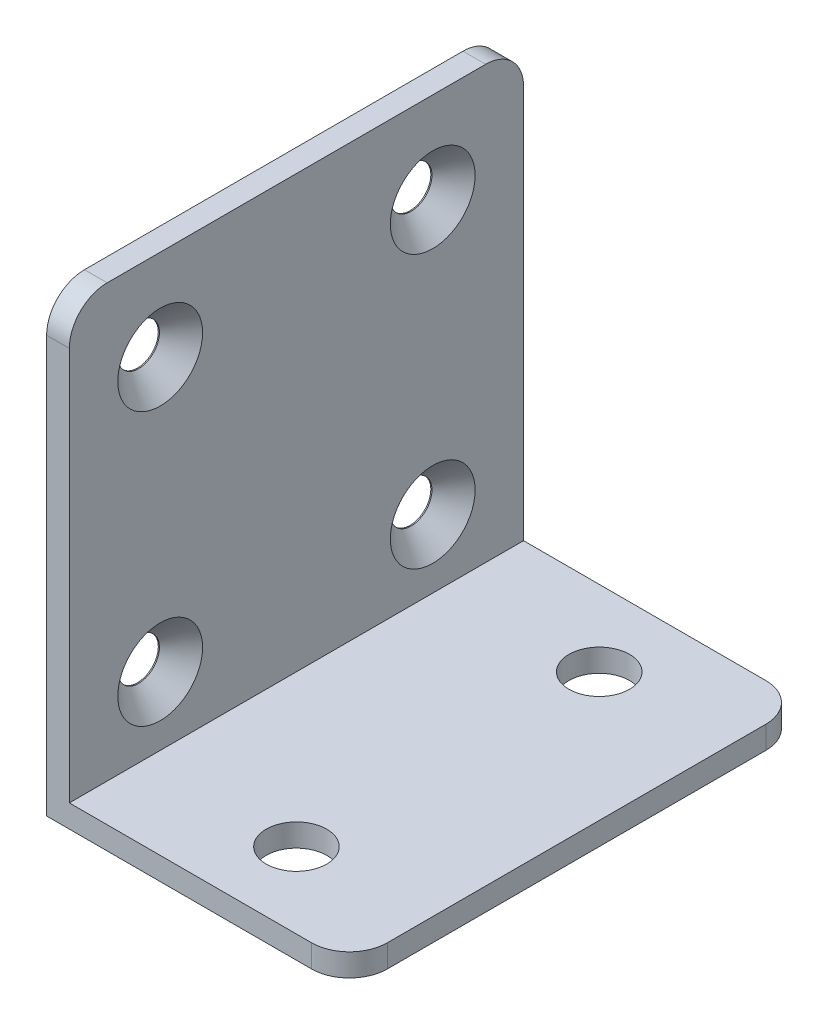
ISO-10303-21;
HEADER;
FILE_DESCRIPTION(('STEP AP214'),'2;1');
FILE_NAME('part.step','',(''),(''),'','','');
FILE_SCHEMA(('AUTOMOTIVE_DESIGN { 1 0 10303 214 1 1 1 1 }'));
ENDSEC;
DATA;
#1=APPLICATION_CONTEXT('core data for automotive mechanical design processes');
#2=APPLICATION_PROTOCOL_DEFINITION('international standard','automotive_design',2000,#1);
#3=PRODUCT_CONTEXT('',#1,'mechanical');
#4=PRODUCT('Part','Part','',(#3));
#5=PRODUCT_RELATED_PRODUCT_CATEGORY('part','',(#4));
#6=PRODUCT_DEFINITION_FORMATION('','',#4);
#7=PRODUCT_DEFINITION_CONTEXT('part definition',#1,'design');
#8=PRODUCT_DEFINITION('design','',#6,#7);
#9=PRODUCT_DEFINITION_SHAPE('','',#8);
#10=(LENGTH_UNIT() NAMED_UNIT(*) SI_UNIT(.MILLI.,.METRE.));
#11=(NAMED_UNIT(*) PLANE_ANGLE_UNIT() SI_UNIT($,.RADIAN.));
#12=(NAMED_UNIT(*) SI_UNIT($,.STERADIAN.) SOLID_ANGLE_UNIT());
#13=UNCERTAINTY_MEASURE_WITH_UNIT(LENGTH_MEASURE(1.E-05),#10,'distance_accuracy_value','');
#14=(GEOMETRIC_REPRESENTATION_CONTEXT(3) GLOBAL_UNCERTAINTY_ASSIGNED_CONTEXT((#13)) GLOBAL_UNIT_ASSIGNED_CONTEXT((#10,
#11,#12)) REPRESENTATION_CONTEXT('',''));
#15=CARTESIAN_POINT('',(0.,0.,0.));
#16=DIRECTION('',(0.,0.,1.));
#17=DIRECTION('',(1.,0.,0.));
#18=AXIS2_PLACEMENT_3D('',#15,#16,#17);
#19=CARTESIAN_POINT('',(20.,-30.,-30.));
#20=DIRECTION('',(1.,0.,0.));
#21=DIRECTION('',(0.,0.,-1.));
#22=AXIS2_PLACEMENT_3D('',#19,#20,#21);
#23=PLANE('',#22);
#24=DIRECTION('',(0.,0.,1.));
#25=VECTOR('',#24,1.);
#26=CARTESIAN_POINT('',(20.,-30.,-30.));
#27=LINE('',#26,#25);
#28=CARTESIAN_POINT('',(20.,-30.,-25.));
#29=VERTEX_POINT('',#28);
#30=CARTESIAN_POINT('',(20.,-30.,25.));
#31=VERTEX_POINT('',#30);
#32=EDGE_CURVE('E160',#29,#31,#27,.T.);
#33=ORIENTED_EDGE('',*,*,#32,.F.);
#34=DIRECTION('',(0.,1.,0.));
#35=VECTOR('',#34,1.);
#36=CARTESIAN_POINT('',(20.,-30.,-25.));
#37=LINE('',#36,#35);
#38=CARTESIAN_POINT('',(20.,-27.,-25.));
#39=VERTEX_POINT('',#38);
#40=EDGE_CURVE('E216',#29,#39,#37,.T.);
#41=ORIENTED_EDGE('',*,*,#40,.T.);
#42=DIRECTION('',(0.,0.,1.));
#43=VECTOR('',#42,1.);
#44=CARTESIAN_POINT('',(20.,-27.,-30.));
#45=LINE('',#44,#43);
#46=CARTESIAN_POINT('',(20.,-27.,25.));
#47=VERTEX_POINT('',#46);
#48=EDGE_CURVE('E135',#39,#47,#45,.T.);
#49=ORIENTED_EDGE('',*,*,#48,.T.);
#50=DIRECTION('',(0.,1.,0.));
#51=VECTOR('',#50,1.);
#52=CARTESIAN_POINT('',(20.,-30.,25.));
#53=LINE('',#52,#51);
#54=EDGE_CURVE('E52',#47,#31,#53,.F.);
#55=ORIENTED_EDGE('',*,*,#54,.T.);
#56=EDGE_LOOP('',(#33,#41,#49,#55));
#57=FACE_BOUND('',#56,.T.);
#58=ADVANCED_FACE('F37',(#57),#23,.T.);
#59=CARTESIAN_POINT('',(-20.,-30.,-30.));
#60=DIRECTION('',(0.,-1.,0.));
#61=DIRECTION('',(0.,0.,-1.));
#62=AXIS2_PLACEMENT_3D('',#59,#60,#61);
#63=PLANE('',#62);
#64=CARTESIAN_POINT('',(3.00000000000002,-30.,20.));
#65=DIRECTION('',(0.,-1.,0.));
#66=DIRECTION('',(0.,0.,-1.));
#67=AXIS2_PLACEMENT_3D('',#64,#65,#66);
#68=CIRCLE('',#67,4.);
#69=CARTESIAN_POINT('',(3.00000000000002,-30.,16.));
#70=VERTEX_POINT('',#69);
#71=EDGE_CURVE('E171',#70,#70,#68,.T.);
#72=ORIENTED_EDGE('',*,*,#71,.F.);
#73=EDGE_LOOP('',(#72));
#74=FACE_BOUND('',#73,.T.);
#75=CARTESIAN_POINT('',(3.00000000000002,-30.,-20.));
#76=DIRECTION('',(0.,-1.,0.));
#77=DIRECTION('',(0.,0.,1.));
#78=AXIS2_PLACEMENT_3D('',#75,#76,#77);
#79=CIRCLE('',#78,4.);
#80=CARTESIAN_POINT('',(3.00000000000002,-30.,-16.));
#81=VERTEX_POINT('',#80);
#82=EDGE_CURVE('E177',#81,#81,#79,.T.);
#83=ORIENTED_EDGE('',*,*,#82,.F.);
#84=EDGE_LOOP('',(#83));
#85=FACE_BOUND('',#84,.T.);
#86=DIRECTION('',(1.,0.,0.));
#87=VECTOR('',#86,1.);
#88=CARTESIAN_POINT('',(-20.,-30.,-30.));
#89=LINE('',#88,#87);
#90=CARTESIAN_POINT('',(-20.,-30.,-30.));
#91=VERTEX_POINT('',#90);
#92=CARTESIAN_POINT('',(15.,-30.,-30.));
#93=VERTEX_POINT('',#92);
#94=EDGE_CURVE('E157',#91,#93,#89,.T.);
#95=ORIENTED_EDGE('',*,*,#94,.T.);
#96=CARTESIAN_POINT('',(15.,-30.,-25.));
#97=DIRECTION('',(0.,-1.,0.));
#98=DIRECTION('',(0.,0.,-1.));
#99=AXIS2_PLACEMENT_3D('',#96,#97,#98);
#100=CIRCLE('',#99,5.);
#101=EDGE_CURVE('E11',#93,#29,#100,.T.);
#102=ORIENTED_EDGE('',*,*,#101,.T.);
#103=ORIENTED_EDGE('',*,*,#32,.T.);
#104=CARTESIAN_POINT('',(15.,-30.,25.));
#105=DIRECTION('',(0.,-1.,0.));
#106=DIRECTION('',(0.,0.,-1.));
#107=AXIS2_PLACEMENT_3D('',#104,#105,#106);
#108=CIRCLE('',#107,5.);
#109=CARTESIAN_POINT('',(15.,-30.,30.));
#110=VERTEX_POINT('',#109);
#111=EDGE_CURVE('E45',#31,#110,#108,.T.);
#112=ORIENTED_EDGE('',*,*,#111,.T.);
#113=DIRECTION('',(1.,0.,0.));
#114=VECTOR('',#113,1.);
#115=CARTESIAN_POINT('',(-20.,-30.,30.));
#116=LINE('',#115,#114);
#117=CARTESIAN_POINT('',(-20.,-30.,30.));
#118=VERTEX_POINT('',#117);
#119=EDGE_CURVE('E152',#118,#110,#116,.T.);
#120=ORIENTED_EDGE('',*,*,#119,.F.);
#121=DIRECTION('',(0.,0.,1.));
#122=VECTOR('',#121,1.);
#123=CARTESIAN_POINT('',(-20.,-30.,-30.));
#124=LINE('',#123,#122);
#125=EDGE_CURVE('E163',#91,#118,#124,.T.);
#126=ORIENTED_EDGE('',*,*,#125,.F.);
#127=EDGE_LOOP('',(#95,#102,#103,#112,#120,#126));
#128=FACE_BOUND('',#127,.T.);
#129=ADVANCED_FACE('F223',(#74,#85,#128),#63,.T.);
#130=CARTESIAN_POINT('',(-20.,-30.,-30.));
#131=DIRECTION('',(-1.,0.,0.));
#132=DIRECTION('',(0.,0.,1.));
#133=AXIS2_PLACEMENT_3D('',#130,#131,#132);
#134=PLANE('',#133);
#135=CARTESIAN_POINT('',(-20.,18.,18.));
#136=DIRECTION('',(-1.,0.,0.));
#137=DIRECTION('',(0.,0.,1.));
#138=AXIS2_PLACEMENT_3D('',#135,#136,#137);
#139=CIRCLE('',#138,2.75);
#140=CARTESIAN_POINT('',(-20.,18.,20.75));
#141=VERTEX_POINT('',#140);
#142=EDGE_CURVE('E189',#141,#141,#139,.T.);
#143=ORIENTED_EDGE('',*,*,#142,.F.);
#144=EDGE_LOOP('',(#143));
#145=FACE_BOUND('',#144,.T.);
#146=CARTESIAN_POINT('',(-20.,18.,-18.));
#147=DIRECTION('',(-1.,0.,0.));
#148=DIRECTION('',(0.,0.,1.));
#149=AXIS2_PLACEMENT_3D('',#146,#147,#148);
#150=CIRCLE('',#149,2.75);
#151=CARTESIAN_POINT('',(-20.,18.,-15.25));
#152=VERTEX_POINT('',#151);
#153=EDGE_CURVE('E184',#152,#152,#150,.T.);
#154=ORIENTED_EDGE('',*,*,#153,.F.);
#155=EDGE_LOOP('',(#154));
#156=FACE_BOUND('',#155,.T.);
#157=CARTESIAN_POINT('',(-20.,-18.,-18.));
#158=DIRECTION('',(-1.,0.,0.));
#159=DIRECTION('',(0.,0.,1.));
#160=AXIS2_PLACEMENT_3D('',#157,#158,#159);
#161=CIRCLE('',#160,2.75);
#162=CARTESIAN_POINT('',(-20.,-18.,-15.25));
#163=VERTEX_POINT('',#162);
#164=EDGE_CURVE('E179',#163,#163,#161,.T.);
#165=ORIENTED_EDGE('',*,*,#164,.F.);
#166=EDGE_LOOP('',(#165));
#167=FACE_BOUND('',#166,.T.);
#168=CARTESIAN_POINT('',(-20.,-18.,18.));
#169=DIRECTION('',(-1.,0.,0.));
#170=DIRECTION('',(0.,0.,1.));
#171=AXIS2_PLACEMENT_3D('',#168,#169,#170);
#172=CIRCLE('',#171,2.75);
#173=CARTESIAN_POINT('',(-20.,-18.,20.75));
#174=VERTEX_POINT('',#173);
#175=EDGE_CURVE('E174',#174,#174,#172,.T.);
#176=ORIENTED_EDGE('',*,*,#175,.F.);
#177=EDGE_LOOP('',(#176));
#178=FACE_BOUND('',#177,.T.);
#179=DIRECTION('',(0.,0.,1.));
#180=VECTOR('',#179,1.);
#181=CARTESIAN_POINT('',(-20.,30.,-30.));
#182=LINE('',#181,#180);
#183=CARTESIAN_POINT('',(-20.,30.,-25.));
#184=VERTEX_POINT('',#183);
#185=CARTESIAN_POINT('',(-20.,30.,25.));
#186=VERTEX_POINT('',#185);
#187=EDGE_CURVE('E159',#184,#186,#182,.T.);
#188=ORIENTED_EDGE('',*,*,#187,.F.);
#189=CARTESIAN_POINT('',(-20.,25.,-25.));
#190=DIRECTION('',(-1.,0.,0.));
#191=DIRECTION('',(0.,0.,1.));
#192=AXIS2_PLACEMENT_3D('',#189,#190,#191);
#193=CIRCLE('',#192,5.);
#194=CARTESIAN_POINT('',(-20.,25.,-30.));
#195=VERTEX_POINT('',#194);
#196=EDGE_CURVE('E200',#184,#195,#193,.T.);
#197=ORIENTED_EDGE('',*,*,#196,.T.);
#198=DIRECTION('',(0.,-1.,0.));
#199=VECTOR('',#198,1.);
#200=CARTESIAN_POINT('',(-20.,-30.,-30.));
#201=LINE('',#200,#199);
#202=EDGE_CURVE('E155',#195,#91,#201,.T.);
#203=ORIENTED_EDGE('',*,*,#202,.T.);
#204=ORIENTED_EDGE('',*,*,#125,.T.);
#205=DIRECTION('',(0.,-1.,0.));
#206=VECTOR('',#205,1.);
#207=CARTESIAN_POINT('',(-20.,-30.,30.));
#208=LINE('',#207,#206);
#209=CARTESIAN_POINT('',(-20.,25.,30.));
#210=VERTEX_POINT('',#209);
#211=EDGE_CURVE('E149',#210,#118,#208,.T.);
#212=ORIENTED_EDGE('',*,*,#211,.F.);
#213=CARTESIAN_POINT('',(-20.,25.,25.));
#214=DIRECTION('',(-1.,0.,0.));
#215=DIRECTION('',(0.,0.,1.));
#216=AXIS2_PLACEMENT_3D('',#213,#214,#215);
#217=CIRCLE('',#216,5.);
#218=EDGE_CURVE('E198',#210,#186,#217,.T.);
#219=ORIENTED_EDGE('',*,*,#218,.T.);
#220=EDGE_LOOP('',(#188,#197,#203,#204,#212,#219));
#221=FACE_BOUND('',#220,.T.);
#222=ADVANCED_FACE('F236',(#145,#156,#167,#178,#221),#134,.T.);
#223=CARTESIAN_POINT('',(-20.,30.,-30.));
#224=DIRECTION('',(0.,1.,0.));
#225=DIRECTION('',(0.,0.,1.));
#226=AXIS2_PLACEMENT_3D('',#223,#224,#225);
#227=PLANE('',#226);
#228=DIRECTION('',(0.,0.,1.));
#229=VECTOR('',#228,1.);
#230=CARTESIAN_POINT('',(-17.,30.,-30.));
#231=LINE('',#230,#229);
#232=CARTESIAN_POINT('',(-17.,30.,-25.));
#233=VERTEX_POINT('',#232);
#234=CARTESIAN_POINT('',(-17.,30.,25.));
#235=VERTEX_POINT('',#234);
#236=EDGE_CURVE('E136',#233,#235,#231,.T.);
#237=ORIENTED_EDGE('',*,*,#236,.F.);
#238=DIRECTION('',(-1.,0.,0.));
#239=VECTOR('',#238,1.);
#240=CARTESIAN_POINT('',(-20.,30.,-25.));
#241=LINE('',#240,#239);
#242=EDGE_CURVE('E195',#233,#184,#241,.T.);
#243=ORIENTED_EDGE('',*,*,#242,.T.);
#244=ORIENTED_EDGE('',*,*,#187,.T.);
#245=DIRECTION('',(-1.,0.,0.));
#246=VECTOR('',#245,1.);
#247=CARTESIAN_POINT('',(-17.,30.,25.));
#248=LINE('',#247,#246);
#249=EDGE_CURVE('E162',#186,#235,#248,.F.);
#250=ORIENTED_EDGE('',*,*,#249,.T.);
#251=EDGE_LOOP('',(#237,#243,#244,#250));
#252=FACE_BOUND('',#251,.T.);
#253=ADVANCED_FACE('F243',(#252),#227,.T.);
#254=CARTESIAN_POINT('',(0.,0.,-30.));
#255=DIRECTION('',(0.,0.,-1.));
#256=DIRECTION('',(-1.,0.,0.));
#257=AXIS2_PLACEMENT_3D('',#254,#255,#256);
#258=PLANE('',#257);
#259=ORIENTED_EDGE('',*,*,#202,.F.);
#260=DIRECTION('',(-1.,0.,0.));
#261=VECTOR('',#260,1.);
#262=CARTESIAN_POINT('',(0.,25.,-30.));
#263=LINE('',#262,#261);
#264=CARTESIAN_POINT('',(-17.,25.,-30.));
#265=VERTEX_POINT('',#264);
#266=EDGE_CURVE('E122',#195,#265,#263,.F.);
#267=ORIENTED_EDGE('',*,*,#266,.T.);
#268=DIRECTION('',(0.,-1.,0.));
#269=VECTOR('',#268,1.);
#270=CARTESIAN_POINT('',(-17.,30.,-30.));
#271=LINE('',#270,#269);
#272=CARTESIAN_POINT('',(-17.,-27.,-30.));
#273=VERTEX_POINT('',#272);
#274=EDGE_CURVE('E114',#265,#273,#271,.T.);
#275=ORIENTED_EDGE('',*,*,#274,.T.);
#276=DIRECTION('',(1.,0.,0.));
#277=VECTOR('',#276,1.);
#278=CARTESIAN_POINT('',(20.,-27.,-30.));
#279=LINE('',#278,#277);
#280=CARTESIAN_POINT('',(15.,-27.,-30.));
#281=VERTEX_POINT('',#280);
#282=EDGE_CURVE('E119',#273,#281,#279,.T.);
#283=ORIENTED_EDGE('',*,*,#282,.T.);
#284=DIRECTION('',(0.,1.,0.));
#285=VECTOR('',#284,1.);
#286=CARTESIAN_POINT('',(15.,0.,-30.));
#287=LINE('',#286,#285);
#288=EDGE_CURVE('E202',#281,#93,#287,.F.);
#289=ORIENTED_EDGE('',*,*,#288,.T.);
#290=ORIENTED_EDGE('',*,*,#94,.F.);
#291=EDGE_LOOP('',(#259,#267,#275,#283,#289,#290));
#292=FACE_BOUND('',#291,.T.);
#293=ADVANCED_FACE('F117',(#292),#258,.T.);
#294=CARTESIAN_POINT('',(0.,0.,30.));
#295=DIRECTION('',(0.,0.,-1.));
#296=DIRECTION('',(-1.,0.,0.));
#297=AXIS2_PLACEMENT_3D('',#294,#295,#296);
#298=PLANE('',#297);
#299=DIRECTION('',(0.,-1.,0.));
#300=VECTOR('',#299,1.);
#301=CARTESIAN_POINT('',(-17.,30.,30.));
#302=LINE('',#301,#300);
#303=CARTESIAN_POINT('',(-17.,25.,30.));
#304=VERTEX_POINT('',#303);
#305=CARTESIAN_POINT('',(-17.,-27.,30.));
#306=VERTEX_POINT('',#305);
#307=EDGE_CURVE('E131',#304,#306,#302,.T.);
#308=ORIENTED_EDGE('',*,*,#307,.F.);
#309=DIRECTION('',(-1.,0.,0.));
#310=VECTOR('',#309,1.);
#311=CARTESIAN_POINT('',(-20.,25.,30.));
#312=LINE('',#311,#310);
#313=EDGE_CURVE('E212',#304,#210,#312,.T.);
#314=ORIENTED_EDGE('',*,*,#313,.T.);
#315=ORIENTED_EDGE('',*,*,#211,.T.);
#316=ORIENTED_EDGE('',*,*,#119,.T.);
#317=DIRECTION('',(0.,1.,0.));
#318=VECTOR('',#317,1.);
#319=CARTESIAN_POINT('',(15.,-27.,30.));
#320=LINE('',#319,#318);
#321=CARTESIAN_POINT('',(15.,-27.,30.));
#322=VERTEX_POINT('',#321);
#323=EDGE_CURVE('E209',#110,#322,#320,.T.);
#324=ORIENTED_EDGE('',*,*,#323,.T.);
#325=DIRECTION('',(1.,0.,0.));
#326=VECTOR('',#325,1.);
#327=CARTESIAN_POINT('',(20.,-27.,30.));
#328=LINE('',#327,#326);
#329=EDGE_CURVE('E125',#306,#322,#328,.T.);
#330=ORIENTED_EDGE('',*,*,#329,.F.);
#331=EDGE_LOOP('',(#308,#314,#315,#316,#324,#330));
#332=FACE_BOUND('',#331,.T.);
#333=ADVANCED_FACE('F228',(#332),#298,.F.);
#334=CARTESIAN_POINT('',(20.,-27.,-30.));
#335=DIRECTION('',(0.,-1.,0.));
#336=DIRECTION('',(1.,0.,0.));
#337=AXIS2_PLACEMENT_3D('',#334,#335,#336);
#338=PLANE('',#337);
#339=CARTESIAN_POINT('',(3.00000000000002,-27.,20.));
#340=DIRECTION('',(0.,-1.,0.));
#341=DIRECTION('',(1.,0.,0.));
#342=AXIS2_PLACEMENT_3D('',#339,#340,#341);
#343=CIRCLE('',#342,4.);
#344=CARTESIAN_POINT('',(7.00000000000002,-27.,20.));
#345=VERTEX_POINT('',#344);
#346=EDGE_CURVE('E147',#345,#345,#343,.T.);
#347=ORIENTED_EDGE('',*,*,#346,.T.);
#348=EDGE_LOOP('',(#347));
#349=FACE_BOUND('',#348,.T.);
#350=CARTESIAN_POINT('',(3.00000000000002,-27.,-20.));
#351=DIRECTION('',(0.,-1.,0.));
#352=DIRECTION('',(1.,0.,0.));
#353=AXIS2_PLACEMENT_3D('',#350,#351,#352);
#354=CIRCLE('',#353,4.);
#355=CARTESIAN_POINT('',(7.00000000000002,-27.,-20.));
#356=VERTEX_POINT('',#355);
#357=EDGE_CURVE('E168',#356,#356,#354,.T.);
#358=ORIENTED_EDGE('',*,*,#357,.T.);
#359=EDGE_LOOP('',(#358));
#360=FACE_BOUND('',#359,.T.);
#361=ORIENTED_EDGE('',*,*,#48,.F.);
#362=CARTESIAN_POINT('',(15.,-27.,-25.));
#363=DIRECTION('',(0.,-1.,0.));
#364=DIRECTION('',(1.,0.,0.));
#365=AXIS2_PLACEMENT_3D('',#362,#363,#364);
#366=CIRCLE('',#365,5.);
#367=EDGE_CURVE('E140',#39,#281,#366,.F.);
#368=ORIENTED_EDGE('',*,*,#367,.T.);
#369=ORIENTED_EDGE('',*,*,#282,.F.);
#370=DIRECTION('',(0.,0.,1.));
#371=VECTOR('',#370,1.);
#372=CARTESIAN_POINT('',(-17.,-27.,-30.));
#373=LINE('',#372,#371);
#374=EDGE_CURVE('E128',#273,#306,#373,.T.);
#375=ORIENTED_EDGE('',*,*,#374,.T.);
#376=ORIENTED_EDGE('',*,*,#329,.T.);
#377=CARTESIAN_POINT('',(15.,-27.,25.));
#378=DIRECTION('',(0.,-1.,0.));
#379=DIRECTION('',(1.,0.,0.));
#380=AXIS2_PLACEMENT_3D('',#377,#378,#379);
#381=CIRCLE('',#380,5.);
#382=EDGE_CURVE('E219',#322,#47,#381,.F.);
#383=ORIENTED_EDGE('',*,*,#382,.T.);
#384=EDGE_LOOP('',(#361,#368,#369,#375,#376,#383));
#385=FACE_BOUND('',#384,.T.);
#386=ADVANCED_FACE('F139',(#349,#360,#385),#338,.F.);
#387=CARTESIAN_POINT('',(-17.,30.,-30.));
#388=DIRECTION('',(-1.,0.,0.));
#389=DIRECTION('',(0.,-1.,0.));
#390=AXIS2_PLACEMENT_3D('',#387,#388,#389);
#391=PLANE('',#390);
#392=CARTESIAN_POINT('',(-17.,18.,18.));
#393=DIRECTION('',(1.,0.,0.));
#394=DIRECTION('',(0.,0.,-1.));
#395=AXIS2_PLACEMENT_3D('',#392,#393,#394);
#396=CIRCLE('',#395,5.6);
#397=CARTESIAN_POINT('',(-17.,18.,12.4));
#398=VERTEX_POINT('',#397);
#399=EDGE_CURVE('E324',#398,#398,#396,.T.);
#400=ORIENTED_EDGE('',*,*,#399,.F.);
#401=EDGE_LOOP('',(#400));
#402=FACE_BOUND('',#401,.T.);
#403=CARTESIAN_POINT('',(-17.,18.,-18.));
#404=DIRECTION('',(1.,0.,0.));
#405=DIRECTION('',(0.,0.,-1.));
#406=AXIS2_PLACEMENT_3D('',#403,#404,#405);
#407=CIRCLE('',#406,5.6);
#408=CARTESIAN_POINT('',(-17.,18.,-23.6));
#409=VERTEX_POINT('',#408);
#410=EDGE_CURVE('E192',#409,#409,#407,.T.);
#411=ORIENTED_EDGE('',*,*,#410,.F.);
#412=EDGE_LOOP('',(#411));
#413=FACE_BOUND('',#412,.T.);
#414=CARTESIAN_POINT('',(-17.,-18.,-18.));
#415=DIRECTION('',(1.,0.,0.));
#416=DIRECTION('',(0.,0.,-1.));
#417=AXIS2_PLACEMENT_3D('',#414,#415,#416);
#418=CIRCLE('',#417,5.6);
#419=CARTESIAN_POINT('',(-17.,-18.,-23.6));
#420=VERTEX_POINT('',#419);
#421=EDGE_CURVE('E187',#420,#420,#418,.T.);
#422=ORIENTED_EDGE('',*,*,#421,.F.);
#423=EDGE_LOOP('',(#422));
#424=FACE_BOUND('',#423,.T.);
#425=CARTESIAN_POINT('',(-17.,-18.,18.));
#426=DIRECTION('',(1.,0.,0.));
#427=DIRECTION('',(0.,0.,-1.));
#428=AXIS2_PLACEMENT_3D('',#425,#426,#427);
#429=CIRCLE('',#428,5.6);
#430=CARTESIAN_POINT('',(-17.,-18.,12.4));
#431=VERTEX_POINT('',#430);
#432=EDGE_CURVE('E182',#431,#431,#429,.T.);
#433=ORIENTED_EDGE('',*,*,#432,.F.);
#434=EDGE_LOOP('',(#433));
#435=FACE_BOUND('',#434,.T.);
#436=ORIENTED_EDGE('',*,*,#274,.F.);
#437=CARTESIAN_POINT('',(-17.,25.,-25.));
#438=DIRECTION('',(-1.,0.,0.));
#439=DIRECTION('',(0.,-1.,0.));
#440=AXIS2_PLACEMENT_3D('',#437,#438,#439);
#441=CIRCLE('',#440,5.);
#442=EDGE_CURVE('E207',#265,#233,#441,.F.);
#443=ORIENTED_EDGE('',*,*,#442,.T.);
#444=ORIENTED_EDGE('',*,*,#236,.T.);
#445=CARTESIAN_POINT('',(-17.,25.,25.));
#446=DIRECTION('',(-1.,0.,0.));
#447=DIRECTION('',(0.,-1.,0.));
#448=AXIS2_PLACEMENT_3D('',#445,#446,#447);
#449=CIRCLE('',#448,5.);
#450=EDGE_CURVE('E205',#235,#304,#449,.F.);
#451=ORIENTED_EDGE('',*,*,#450,.T.);
#452=ORIENTED_EDGE('',*,*,#307,.T.);
#453=ORIENTED_EDGE('',*,*,#374,.F.);
#454=EDGE_LOOP('',(#436,#443,#444,#451,#452,#453));
#455=FACE_BOUND('',#454,.T.);
#456=ADVANCED_FACE('F129',(#402,#413,#424,#435,#455),#391,.F.);
#457=CARTESIAN_POINT('',(3.00000000000002,10.,-20.));
#458=DIRECTION('',(0.,-1.,0.));
#459=DIRECTION('',(0.,0.,-1.));
#460=AXIS2_PLACEMENT_3D('',#457,#458,#459);
#461=CYLINDRICAL_SURFACE('',#460,4.);
#462=ORIENTED_EDGE('',*,*,#82,.T.);
#463=EDGE_LOOP('',(#462));
#464=FACE_BOUND('',#463,.T.);
#465=ORIENTED_EDGE('',*,*,#357,.F.);
#466=EDGE_LOOP('',(#465));
#467=FACE_BOUND('',#466,.T.);
#468=ADVANCED_FACE('F275',(#464,#467),#461,.F.);
#469=CARTESIAN_POINT('',(3.00000000000002,10.,20.));
#470=DIRECTION('',(0.,-1.,0.));
#471=DIRECTION('',(0.,0.,-1.));
#472=AXIS2_PLACEMENT_3D('',#469,#470,#471);
#473=CYLINDRICAL_SURFACE('',#472,4.);
#474=ORIENTED_EDGE('',*,*,#71,.T.);
#475=EDGE_LOOP('',(#474));
#476=FACE_BOUND('',#475,.T.);
#477=ORIENTED_EDGE('',*,*,#346,.F.);
#478=EDGE_LOOP('',(#477));
#479=FACE_BOUND('',#478,.T.);
#480=ADVANCED_FACE('F282',(#476,#479),#473,.F.);
#481=CARTESIAN_POINT('',(-17.,-18.,18.));
#482=DIRECTION('',(1.,0.,0.));
#483=DIRECTION('',(0.,0.,-1.));
#484=AXIS2_PLACEMENT_3D('',#481,#482,#483);
#485=CYLINDRICAL_SURFACE('',#484,2.75);
#486=ORIENTED_EDGE('',*,*,#175,.T.);
#487=EDGE_LOOP('',(#486));
#488=FACE_BOUND('',#487,.T.);
#489=CARTESIAN_POINT('',(-19.85,-18.,18.));
#490=DIRECTION('',(1.,0.,0.));
#491=DIRECTION('',(0.,0.,-1.));
#492=AXIS2_PLACEMENT_3D('',#489,#490,#491);
#493=CIRCLE('',#492,2.75);
#494=CARTESIAN_POINT('',(-19.85,-18.,15.25));
#495=VERTEX_POINT('',#494);
#496=EDGE_CURVE('E178',#495,#495,#493,.T.);
#497=ORIENTED_EDGE('',*,*,#496,.T.);
#498=EDGE_LOOP('',(#497));
#499=FACE_BOUND('',#498,.T.);
#500=ADVANCED_FACE('F286',(#488,#499),#485,.F.);
#501=CARTESIAN_POINT('',(-17.,-18.,18.));
#502=DIRECTION('',(1.,0.,0.));
#503=DIRECTION('',(0.,0.,-1.));
#504=AXIS2_PLACEMENT_3D('',#501,#502,#503);
#505=CONICAL_SURFACE('',#504,5.6,0.785398163397448);
#506=ORIENTED_EDGE('',*,*,#496,.F.);
#507=EDGE_LOOP('',(#506));
#508=FACE_BOUND('',#507,.T.);
#509=ORIENTED_EDGE('',*,*,#432,.T.);
#510=EDGE_LOOP('',(#509));
#511=FACE_BOUND('',#510,.T.);
#512=ADVANCED_FACE('F290',(#508,#511),#505,.F.);
#513=CARTESIAN_POINT('',(-17.,-18.,-18.));
#514=DIRECTION('',(1.,0.,0.));
#515=DIRECTION('',(0.,0.,-1.));
#516=AXIS2_PLACEMENT_3D('',#513,#514,#515);
#517=CYLINDRICAL_SURFACE('',#516,2.75);
#518=ORIENTED_EDGE('',*,*,#164,.T.);
#519=EDGE_LOOP('',(#518));
#520=FACE_BOUND('',#519,.T.);
#521=CARTESIAN_POINT('',(-19.85,-18.,-18.));
#522=DIRECTION('',(1.,0.,0.));
#523=DIRECTION('',(0.,0.,-1.));
#524=AXIS2_PLACEMENT_3D('',#521,#522,#523);
#525=CIRCLE('',#524,2.75);
#526=CARTESIAN_POINT('',(-19.85,-18.,-20.75));
#527=VERTEX_POINT('',#526);
#528=EDGE_CURVE('E183',#527,#527,#525,.T.);
#529=ORIENTED_EDGE('',*,*,#528,.T.);
#530=EDGE_LOOP('',(#529));
#531=FACE_BOUND('',#530,.T.);
#532=ADVANCED_FACE('F294',(#520,#531),#517,.F.);
#533=CARTESIAN_POINT('',(-17.,-18.,-18.));
#534=DIRECTION('',(1.,0.,0.));
#535=DIRECTION('',(0.,0.,-1.));
#536=AXIS2_PLACEMENT_3D('',#533,#534,#535);
#537=CONICAL_SURFACE('',#536,5.6,0.785398163397448);
#538=ORIENTED_EDGE('',*,*,#528,.F.);
#539=EDGE_LOOP('',(#538));
#540=FACE_BOUND('',#539,.T.);
#541=ORIENTED_EDGE('',*,*,#421,.T.);
#542=EDGE_LOOP('',(#541));
#543=FACE_BOUND('',#542,.T.);
#544=ADVANCED_FACE('F298',(#540,#543),#537,.F.);
#545=CARTESIAN_POINT('',(-17.,18.,-18.));
#546=DIRECTION('',(1.,0.,0.));
#547=DIRECTION('',(0.,0.,-1.));
#548=AXIS2_PLACEMENT_3D('',#545,#546,#547);
#549=CYLINDRICAL_SURFACE('',#548,2.75);
#550=ORIENTED_EDGE('',*,*,#153,.T.);
#551=EDGE_LOOP('',(#550));
#552=FACE_BOUND('',#551,.T.);
#553=CARTESIAN_POINT('',(-19.85,18.,-18.));
#554=DIRECTION('',(1.,0.,0.));
#555=DIRECTION('',(0.,0.,-1.));
#556=AXIS2_PLACEMENT_3D('',#553,#554,#555);
#557=CIRCLE('',#556,2.75);
#558=CARTESIAN_POINT('',(-19.85,18.,-20.75));
#559=VERTEX_POINT('',#558);
#560=EDGE_CURVE('E188',#559,#559,#557,.T.);
#561=ORIENTED_EDGE('',*,*,#560,.T.);
#562=EDGE_LOOP('',(#561));
#563=FACE_BOUND('',#562,.T.);
#564=ADVANCED_FACE('F302',(#552,#563),#549,.F.);
#565=CARTESIAN_POINT('',(-17.,18.,-18.));
#566=DIRECTION('',(1.,0.,0.));
#567=DIRECTION('',(0.,0.,-1.));
#568=AXIS2_PLACEMENT_3D('',#565,#566,#567);
#569=CONICAL_SURFACE('',#568,5.6,0.785398163397448);
#570=ORIENTED_EDGE('',*,*,#560,.F.);
#571=EDGE_LOOP('',(#570));
#572=FACE_BOUND('',#571,.T.);
#573=ORIENTED_EDGE('',*,*,#410,.T.);
#574=EDGE_LOOP('',(#573));
#575=FACE_BOUND('',#574,.T.);
#576=ADVANCED_FACE('F306',(#572,#575),#569,.F.);
#577=CARTESIAN_POINT('',(-17.,18.,18.));
#578=DIRECTION('',(1.,0.,0.));
#579=DIRECTION('',(0.,0.,-1.));
#580=AXIS2_PLACEMENT_3D('',#577,#578,#579);
#581=CYLINDRICAL_SURFACE('',#580,2.75);
#582=ORIENTED_EDGE('',*,*,#142,.T.);
#583=EDGE_LOOP('',(#582));
#584=FACE_BOUND('',#583,.T.);
#585=CARTESIAN_POINT('',(-19.85,18.,18.));
#586=DIRECTION('',(1.,0.,0.));
#587=DIRECTION('',(0.,0.,-1.));
#588=AXIS2_PLACEMENT_3D('',#585,#586,#587);
#589=CIRCLE('',#588,2.75);
#590=CARTESIAN_POINT('',(-19.85,18.,15.25));
#591=VERTEX_POINT('',#590);
#592=EDGE_CURVE('E193',#591,#591,#589,.T.);
#593=ORIENTED_EDGE('',*,*,#592,.T.);
#594=EDGE_LOOP('',(#593));
#595=FACE_BOUND('',#594,.T.);
#596=ADVANCED_FACE('F310',(#584,#595),#581,.F.);
#597=CARTESIAN_POINT('',(-17.,18.,18.));
#598=DIRECTION('',(1.,0.,0.));
#599=DIRECTION('',(0.,0.,-1.));
#600=AXIS2_PLACEMENT_3D('',#597,#598,#599);
#601=CONICAL_SURFACE('',#600,5.6,0.785398163397448);
#602=ORIENTED_EDGE('',*,*,#592,.F.);
#603=EDGE_LOOP('',(#602));
#604=FACE_BOUND('',#603,.T.);
#605=ORIENTED_EDGE('',*,*,#399,.T.);
#606=EDGE_LOOP('',(#605));
#607=FACE_BOUND('',#606,.T.);
#608=ADVANCED_FACE('F254',(#604,#607),#601,.F.);
#609=CARTESIAN_POINT('',(-20.,25.,-25.));
#610=DIRECTION('',(-1.,0.,0.));
#611=DIRECTION('',(0.,0.,1.));
#612=AXIS2_PLACEMENT_3D('',#609,#610,#611);
#613=CYLINDRICAL_SURFACE('',#612,5.);
#614=ORIENTED_EDGE('',*,*,#442,.F.);
#615=ORIENTED_EDGE('',*,*,#266,.F.);
#616=ORIENTED_EDGE('',*,*,#196,.F.);
#617=ORIENTED_EDGE('',*,*,#242,.F.);
#618=EDGE_LOOP('',(#614,#615,#616,#617));
#619=FACE_BOUND('',#618,.T.);
#620=ADVANCED_FACE('F238',(#619),#613,.T.);
#621=CARTESIAN_POINT('',(0.,25.,25.));
#622=DIRECTION('',(1.,0.,0.));
#623=DIRECTION('',(0.,0.,-1.));
#624=AXIS2_PLACEMENT_3D('',#621,#622,#623);
#625=CYLINDRICAL_SURFACE('',#624,5.);
#626=ORIENTED_EDGE('',*,*,#450,.F.);
#627=ORIENTED_EDGE('',*,*,#249,.F.);
#628=ORIENTED_EDGE('',*,*,#218,.F.);
#629=ORIENTED_EDGE('',*,*,#313,.F.);
#630=EDGE_LOOP('',(#626,#627,#628,#629));
#631=FACE_BOUND('',#630,.T.);
#632=ADVANCED_FACE('F246',(#631),#625,.T.);
#633=CARTESIAN_POINT('',(15.,-30.,-25.));
#634=DIRECTION('',(0.,1.,0.));
#635=DIRECTION('',(0.,0.,1.));
#636=AXIS2_PLACEMENT_3D('',#633,#634,#635);
#637=CYLINDRICAL_SURFACE('',#636,5.);
#638=ORIENTED_EDGE('',*,*,#101,.F.);
#639=ORIENTED_EDGE('',*,*,#288,.F.);
#640=ORIENTED_EDGE('',*,*,#367,.F.);
#641=ORIENTED_EDGE('',*,*,#40,.F.);
#642=EDGE_LOOP('',(#638,#639,#640,#641));
#643=FACE_BOUND('',#642,.T.);
#644=ADVANCED_FACE('F232',(#643),#637,.T.);
#645=CARTESIAN_POINT('',(15.,0.,25.));
#646=DIRECTION('',(0.,-1.,0.));
#647=DIRECTION('',(0.,0.,-1.));
#648=AXIS2_PLACEMENT_3D('',#645,#646,#647);
#649=CYLINDRICAL_SURFACE('',#648,5.);
#650=ORIENTED_EDGE('',*,*,#111,.F.);
#651=ORIENTED_EDGE('',*,*,#54,.F.);
#652=ORIENTED_EDGE('',*,*,#382,.F.);
#653=ORIENTED_EDGE('',*,*,#323,.F.);
#654=EDGE_LOOP('',(#650,#651,#652,#653));
#655=FACE_BOUND('',#654,.T.);
#656=ADVANCED_FACE('F39',(#655),#649,.T.);
#657=CLOSED_SHELL('',(#58,#129,#222,#253,#293,#333,#386,#456,#468,#480,#500,#512,#532,#544,#564,
#576,#596,#608,#620,#632,#644,#656));
#658=MANIFOLD_SOLID_BREP('B2',#657);
#659=ADVANCED_BREP_SHAPE_REPRESENTATION('',(#18,#658),#14);
#660=SHAPE_DEFINITION_REPRESENTATION(#9,#659);
ENDSEC;
END-ISO-10303-21;
